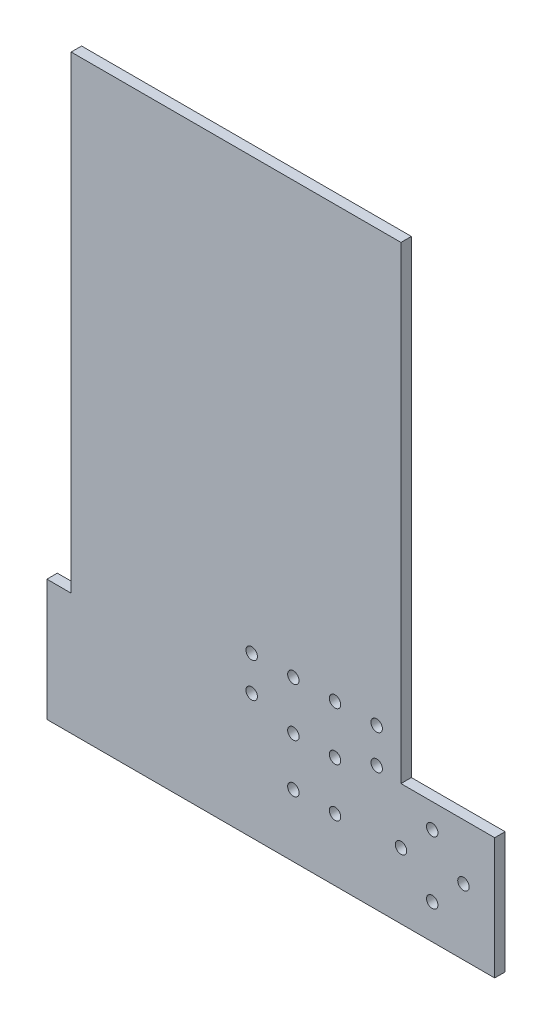
ISO-10303-21;
HEADER;
FILE_DESCRIPTION(('STEP AP214'),'2;1');
FILE_NAME('part.step','',(''),(''),'','','');
FILE_SCHEMA(('AUTOMOTIVE_DESIGN { 1 0 10303 214 1 1 1 1 }'));
ENDSEC;
DATA;
#1=APPLICATION_CONTEXT('core data for automotive mechanical design processes');
#2=APPLICATION_PROTOCOL_DEFINITION('international standard','automotive_design',2000,#1);
#3=PRODUCT_CONTEXT('',#1,'mechanical');
#4=PRODUCT('Part','Part','',(#3));
#5=PRODUCT_RELATED_PRODUCT_CATEGORY('part','',(#4));
#6=PRODUCT_DEFINITION_FORMATION('','',#4);
#7=PRODUCT_DEFINITION_CONTEXT('part definition',#1,'design');
#8=PRODUCT_DEFINITION('design','',#6,#7);
#9=PRODUCT_DEFINITION_SHAPE('','',#8);
#10=(LENGTH_UNIT() NAMED_UNIT(*) SI_UNIT(.MILLI.,.METRE.));
#11=(NAMED_UNIT(*) PLANE_ANGLE_UNIT() SI_UNIT($,.RADIAN.));
#12=(NAMED_UNIT(*) SI_UNIT($,.STERADIAN.) SOLID_ANGLE_UNIT());
#13=UNCERTAINTY_MEASURE_WITH_UNIT(LENGTH_MEASURE(1.E-05),#10,'distance_accuracy_value','');
#14=(GEOMETRIC_REPRESENTATION_CONTEXT(3) GLOBAL_UNCERTAINTY_ASSIGNED_CONTEXT((#13)) GLOBAL_UNIT_ASSIGNED_CONTEXT((#10,
#11,#12)) REPRESENTATION_CONTEXT('',''));
#15=CARTESIAN_POINT('',(0.,0.,0.));
#16=DIRECTION('',(0.,0.,1.));
#17=DIRECTION('',(1.,0.,0.));
#18=AXIS2_PLACEMENT_3D('',#15,#16,#17);
#19=CARTESIAN_POINT('',(0.,0.,3.));
#20=DIRECTION('',(0.,-1.,0.));
#21=DIRECTION('',(0.,0.,-1.));
#22=AXIS2_PLACEMENT_3D('',#19,#20,#21);
#23=PLANE('',#22);
#24=DIRECTION('',(0.,0.,1.));
#25=VECTOR('',#24,1.);
#26=CARTESIAN_POINT('',(-17.,0.,0.));
#27=LINE('',#26,#25);
#28=CARTESIAN_POINT('',(-17.,0.,0.));
#29=VERTEX_POINT('',#28);
#30=CARTESIAN_POINT('',(-17.,0.,3.));
#31=VERTEX_POINT('',#30);
#32=EDGE_CURVE('E160',#29,#31,#27,.T.);
#33=ORIENTED_EDGE('',*,*,#32,.F.);
#34=DIRECTION('',(-1.,0.,0.));
#35=VECTOR('',#34,1.);
#36=CARTESIAN_POINT('',(0.,0.,0.));
#37=LINE('',#36,#35);
#38=CARTESIAN_POINT('',(-24.,0.,0.));
#39=VERTEX_POINT('',#38);
#40=EDGE_CURVE('E81',#29,#39,#37,.T.);
#41=ORIENTED_EDGE('',*,*,#40,.T.);
#42=DIRECTION('',(0.,0.,1.));
#43=VECTOR('',#42,1.);
#44=CARTESIAN_POINT('',(-24.,0.,0.));
#45=LINE('',#44,#43);
#46=CARTESIAN_POINT('',(-24.,0.,3.));
#47=VERTEX_POINT('',#46);
#48=EDGE_CURVE('E173',#39,#47,#45,.T.);
#49=ORIENTED_EDGE('',*,*,#48,.T.);
#50=DIRECTION('',(-1.,0.,0.));
#51=VECTOR('',#50,1.);
#52=CARTESIAN_POINT('',(0.,0.,3.));
#53=LINE('',#52,#51);
#54=EDGE_CURVE('E182',#31,#47,#53,.T.);
#55=ORIENTED_EDGE('',*,*,#54,.F.);
#56=EDGE_LOOP('',(#33,#41,#49,#55));
#57=FACE_BOUND('',#56,.T.);
#58=ADVANCED_FACE('F35',(#57),#23,.F.);
#59=CARTESIAN_POINT('',(0.,-35.,3.));
#60=DIRECTION('',(0.,1.,0.));
#61=DIRECTION('',(0.,0.,1.));
#62=AXIS2_PLACEMENT_3D('',#59,#60,#61);
#63=PLANE('',#62);
#64=DIRECTION('',(1.,0.,0.));
#65=VECTOR('',#64,1.);
#66=CARTESIAN_POINT('',(0.,-35.,0.));
#67=LINE('',#66,#65);
#68=CARTESIAN_POINT('',(-24.,-35.,0.));
#69=VERTEX_POINT('',#68);
#70=CARTESIAN_POINT('',(105.,-35.,0.));
#71=VERTEX_POINT('',#70);
#72=EDGE_CURVE('E82',#69,#71,#67,.T.);
#73=ORIENTED_EDGE('',*,*,#72,.T.);
#74=DIRECTION('',(0.,0.,-1.));
#75=VECTOR('',#74,1.);
#76=CARTESIAN_POINT('',(105.,-35.,3.));
#77=LINE('',#76,#75);
#78=CARTESIAN_POINT('',(105.,-35.,3.));
#79=VERTEX_POINT('',#78);
#80=EDGE_CURVE('E11',#79,#71,#77,.T.);
#81=ORIENTED_EDGE('',*,*,#80,.F.);
#82=DIRECTION('',(1.,0.,0.));
#83=VECTOR('',#82,1.);
#84=CARTESIAN_POINT('',(0.,-35.,3.));
#85=LINE('',#84,#83);
#86=CARTESIAN_POINT('',(-24.,-35.,3.));
#87=VERTEX_POINT('',#86);
#88=EDGE_CURVE('E96',#87,#79,#85,.T.);
#89=ORIENTED_EDGE('',*,*,#88,.F.);
#90=DIRECTION('',(0.,0.,1.));
#91=VECTOR('',#90,1.);
#92=CARTESIAN_POINT('',(-24.,-35.,0.));
#93=LINE('',#92,#91);
#94=EDGE_CURVE('E176',#69,#87,#93,.T.);
#95=ORIENTED_EDGE('',*,*,#94,.F.);
#96=EDGE_LOOP('',(#73,#81,#89,#95));
#97=FACE_BOUND('',#96,.T.);
#98=ADVANCED_FACE('F37',(#97),#63,.F.);
#99=CARTESIAN_POINT('',(105.,0.,3.));
#100=DIRECTION('',(-1.,0.,0.));
#101=DIRECTION('',(0.,0.,1.));
#102=AXIS2_PLACEMENT_3D('',#99,#100,#101);
#103=PLANE('',#102);
#104=DIRECTION('',(0.,1.,0.));
#105=VECTOR('',#104,1.);
#106=CARTESIAN_POINT('',(105.,0.,0.));
#107=LINE('',#106,#105);
#108=CARTESIAN_POINT('',(105.,0.,0.));
#109=VERTEX_POINT('',#108);
#110=EDGE_CURVE('E73',#71,#109,#107,.T.);
#111=ORIENTED_EDGE('',*,*,#110,.T.);
#112=DIRECTION('',(0.,0.,-1.));
#113=VECTOR('',#112,1.);
#114=CARTESIAN_POINT('',(105.,0.,3.));
#115=LINE('',#114,#113);
#116=CARTESIAN_POINT('',(105.,0.,3.));
#117=VERTEX_POINT('',#116);
#118=EDGE_CURVE('E44',#117,#109,#115,.T.);
#119=ORIENTED_EDGE('',*,*,#118,.F.);
#120=DIRECTION('',(0.,1.,0.));
#121=VECTOR('',#120,1.);
#122=CARTESIAN_POINT('',(105.,0.,3.));
#123=LINE('',#122,#121);
#124=EDGE_CURVE('E61',#79,#117,#123,.T.);
#125=ORIENTED_EDGE('',*,*,#124,.F.);
#126=ORIENTED_EDGE('',*,*,#80,.T.);
#127=EDGE_LOOP('',(#111,#119,#125,#126));
#128=FACE_BOUND('',#127,.T.);
#129=ADVANCED_FACE('F75',(#128),#103,.F.);
#130=CARTESIAN_POINT('',(78.,0.,0.));
#131=VERTEX_POINT('',#130);
#132=EDGE_CURVE('E88',#109,#131,#37,.T.);
#133=ORIENTED_EDGE('',*,*,#132,.T.);
#134=DIRECTION('',(0.,0.,1.));
#135=VECTOR('',#134,1.);
#136=CARTESIAN_POINT('',(78.,0.,0.));
#137=LINE('',#136,#135);
#138=CARTESIAN_POINT('',(78.,0.,3.));
#139=VERTEX_POINT('',#138);
#140=EDGE_CURVE('E152',#131,#139,#137,.T.);
#141=ORIENTED_EDGE('',*,*,#140,.T.);
#142=EDGE_CURVE('E89',#117,#139,#53,.T.);
#143=ORIENTED_EDGE('',*,*,#142,.F.);
#144=ORIENTED_EDGE('',*,*,#118,.T.);
#145=EDGE_LOOP('',(#133,#141,#143,#144));
#146=FACE_BOUND('',#145,.T.);
#147=ADVANCED_FACE('F86',(#146),#23,.F.);
#148=CARTESIAN_POINT('',(0.,0.,3.));
#149=DIRECTION('',(0.,0.,1.));
#150=DIRECTION('',(1.,0.,0.));
#151=AXIS2_PLACEMENT_3D('',#148,#149,#150);
#152=PLANE('',#151);
#153=CARTESIAN_POINT('',(59.0000000000001,-17.0000000000036,3.));
#154=DIRECTION('',(0.,0.,1.));
#155=DIRECTION('',(1.,0.,0.));
#156=AXIS2_PLACEMENT_3D('',#153,#154,#155);
#157=CIRCLE('',#156,1.65);
#158=CARTESIAN_POINT('',(60.6500000000001,-17.0000000000036,3.));
#159=VERTEX_POINT('',#158);
#160=EDGE_CURVE('E447',#159,#159,#157,.T.);
#161=ORIENTED_EDGE('',*,*,#160,.F.);
#162=EDGE_LOOP('',(#161));
#163=FACE_BOUND('',#162,.T.);
#164=CARTESIAN_POINT('',(59.0000000000001,-3.00000000000365,3.));
#165=DIRECTION('',(0.,0.,1.));
#166=DIRECTION('',(1.,0.,0.));
#167=AXIS2_PLACEMENT_3D('',#164,#165,#166);
#168=CIRCLE('',#167,1.65);
#169=CARTESIAN_POINT('',(60.6500000000001,-3.00000000000365,3.));
#170=VERTEX_POINT('',#169);
#171=EDGE_CURVE('E449',#170,#170,#168,.T.);
#172=ORIENTED_EDGE('',*,*,#171,.F.);
#173=EDGE_LOOP('',(#172));
#174=FACE_BOUND('',#173,.T.);
#175=CARTESIAN_POINT('',(47.0000000000001,-3.00000000000364,3.));
#176=DIRECTION('',(0.,0.,1.));
#177=DIRECTION('',(1.,0.,0.));
#178=AXIS2_PLACEMENT_3D('',#175,#176,#177);
#179=CIRCLE('',#178,1.65);
#180=CARTESIAN_POINT('',(48.6500000000001,-3.00000000000364,3.));
#181=VERTEX_POINT('',#180);
#182=EDGE_CURVE('E455',#181,#181,#179,.T.);
#183=ORIENTED_EDGE('',*,*,#182,.F.);
#184=EDGE_LOOP('',(#183));
#185=FACE_BOUND('',#184,.T.);
#186=CARTESIAN_POINT('',(59.0000000000001,10.9999999999963,3.));
#187=DIRECTION('',(0.,0.,1.));
#188=DIRECTION('',(1.,0.,0.));
#189=AXIS2_PLACEMENT_3D('',#186,#187,#188);
#190=CIRCLE('',#189,1.65);
#191=CARTESIAN_POINT('',(60.6500000000001,10.9999999999963,3.));
#192=VERTEX_POINT('',#191);
#193=EDGE_CURVE('E458',#192,#192,#190,.T.);
#194=ORIENTED_EDGE('',*,*,#193,.F.);
#195=EDGE_LOOP('',(#194));
#196=FACE_BOUND('',#195,.T.);
#197=CARTESIAN_POINT('',(35.0000000000001,10.9999999999964,3.));
#198=DIRECTION('',(0.,0.,1.));
#199=DIRECTION('',(1.,0.,0.));
#200=AXIS2_PLACEMENT_3D('',#197,#198,#199);
#201=CIRCLE('',#200,1.65);
#202=CARTESIAN_POINT('',(36.6500000000001,10.9999999999964,3.));
#203=VERTEX_POINT('',#202);
#204=EDGE_CURVE('E464',#203,#203,#201,.T.);
#205=ORIENTED_EDGE('',*,*,#204,.F.);
#206=EDGE_LOOP('',(#205));
#207=FACE_BOUND('',#206,.T.);
#208=CARTESIAN_POINT('',(71.0000000000001,0.999999999996344,3.));
#209=DIRECTION('',(0.,0.,1.));
#210=DIRECTION('',(1.,0.,0.));
#211=AXIS2_PLACEMENT_3D('',#208,#209,#210);
#212=CIRCLE('',#211,1.65);
#213=CARTESIAN_POINT('',(72.6500000000001,0.999999999996344,3.));
#214=VERTEX_POINT('',#213);
#215=EDGE_CURVE('E462',#214,#214,#212,.T.);
#216=ORIENTED_EDGE('',*,*,#215,.F.);
#217=EDGE_LOOP('',(#216));
#218=FACE_BOUND('',#217,.T.);
#219=CARTESIAN_POINT('',(71.0000000000001,10.9999999999963,3.));
#220=DIRECTION('',(0.,0.,1.));
#221=DIRECTION('',(1.,0.,0.));
#222=AXIS2_PLACEMENT_3D('',#219,#220,#221);
#223=CIRCLE('',#222,1.65);
#224=CARTESIAN_POINT('',(72.6500000000001,10.9999999999963,3.));
#225=VERTEX_POINT('',#224);
#226=EDGE_CURVE('E452',#225,#225,#223,.T.);
#227=ORIENTED_EDGE('',*,*,#226,.F.);
#228=EDGE_LOOP('',(#227));
#229=FACE_BOUND('',#228,.T.);
#230=CARTESIAN_POINT('',(47.0000000000001,-17.0000000000036,3.));
#231=DIRECTION('',(0.,0.,1.));
#232=DIRECTION('',(1.,0.,0.));
#233=AXIS2_PLACEMENT_3D('',#230,#231,#232);
#234=CIRCLE('',#233,1.65);
#235=CARTESIAN_POINT('',(48.6500000000001,-17.0000000000036,3.));
#236=VERTEX_POINT('',#235);
#237=EDGE_CURVE('E448',#236,#236,#234,.T.);
#238=ORIENTED_EDGE('',*,*,#237,.F.);
#239=EDGE_LOOP('',(#238));
#240=FACE_BOUND('',#239,.T.);
#241=CARTESIAN_POINT('',(47.0000000000001,10.9999999999964,3.));
#242=DIRECTION('',(0.,0.,1.));
#243=DIRECTION('',(1.,0.,0.));
#244=AXIS2_PLACEMENT_3D('',#241,#242,#243);
#245=CIRCLE('',#244,1.65);
#246=CARTESIAN_POINT('',(48.6500000000001,10.9999999999964,3.));
#247=VERTEX_POINT('',#246);
#248=EDGE_CURVE('E518',#247,#247,#245,.T.);
#249=ORIENTED_EDGE('',*,*,#248,.F.);
#250=EDGE_LOOP('',(#249));
#251=FACE_BOUND('',#250,.T.);
#252=CARTESIAN_POINT('',(35.0000000000001,0.999999999996365,3.));
#253=DIRECTION('',(0.,0.,1.));
#254=DIRECTION('',(1.,0.,0.));
#255=AXIS2_PLACEMENT_3D('',#252,#253,#254);
#256=CIRCLE('',#255,1.65);
#257=CARTESIAN_POINT('',(36.6500000000001,0.999999999996365,3.));
#258=VERTEX_POINT('',#257);
#259=EDGE_CURVE('E106',#258,#258,#256,.T.);
#260=ORIENTED_EDGE('',*,*,#259,.F.);
#261=EDGE_LOOP('',(#260));
#262=FACE_BOUND('',#261,.T.);
#263=CARTESIAN_POINT('',(87.0000000000002,-6.99999999999954,3.));
#264=DIRECTION('',(0.,0.,-1.));
#265=DIRECTION('',(-1.,0.,0.));
#266=AXIS2_PLACEMENT_3D('',#263,#264,#265);
#267=CIRCLE('',#266,1.65);
#268=CARTESIAN_POINT('',(85.3500000000002,-6.99999999999954,3.));
#269=VERTEX_POINT('',#268);
#270=EDGE_CURVE('E155',#269,#269,#267,.T.);
#271=ORIENTED_EDGE('',*,*,#270,.T.);
#272=EDGE_LOOP('',(#271));
#273=FACE_BOUND('',#272,.T.);
#274=CARTESIAN_POINT('',(96.0000000000002,-15.9999999999995,3.));
#275=DIRECTION('',(0.,0.,-1.));
#276=DIRECTION('',(-1.,0.,0.));
#277=AXIS2_PLACEMENT_3D('',#274,#275,#276);
#278=CIRCLE('',#277,1.65);
#279=CARTESIAN_POINT('',(94.3500000000002,-15.9999999999995,3.));
#280=VERTEX_POINT('',#279);
#281=EDGE_CURVE('E476',#280,#280,#278,.T.);
#282=ORIENTED_EDGE('',*,*,#281,.T.);
#283=EDGE_LOOP('',(#282));
#284=FACE_BOUND('',#283,.T.);
#285=CARTESIAN_POINT('',(87.0000000000002,-24.9999999999995,3.));
#286=DIRECTION('',(0.,0.,-1.));
#287=DIRECTION('',(-1.,0.,0.));
#288=AXIS2_PLACEMENT_3D('',#285,#286,#287);
#289=CIRCLE('',#288,1.65);
#290=CARTESIAN_POINT('',(85.3500000000002,-24.9999999999995,3.));
#291=VERTEX_POINT('',#290);
#292=EDGE_CURVE('E482',#291,#291,#289,.T.);
#293=ORIENTED_EDGE('',*,*,#292,.T.);
#294=EDGE_LOOP('',(#293));
#295=FACE_BOUND('',#294,.T.);
#296=CARTESIAN_POINT('',(78.0000000000002,-15.9999999999995,3.));
#297=DIRECTION('',(0.,0.,-1.));
#298=DIRECTION('',(-1.,0.,0.));
#299=AXIS2_PLACEMENT_3D('',#296,#297,#298);
#300=CIRCLE('',#299,1.65);
#301=CARTESIAN_POINT('',(76.3500000000002,-15.9999999999995,3.));
#302=VERTEX_POINT('',#301);
#303=EDGE_CURVE('E135',#302,#302,#300,.T.);
#304=ORIENTED_EDGE('',*,*,#303,.T.);
#305=EDGE_LOOP('',(#304));
#306=FACE_BOUND('',#305,.T.);
#307=ORIENTED_EDGE('',*,*,#142,.T.);
#308=DIRECTION('',(0.,1.,0.));
#309=VECTOR('',#308,1.);
#310=CARTESIAN_POINT('',(78.,135.,3.));
#311=LINE('',#310,#309);
#312=CARTESIAN_POINT('',(78.,135.,3.));
#313=VERTEX_POINT('',#312);
#314=EDGE_CURVE('E52',#139,#313,#311,.T.);
#315=ORIENTED_EDGE('',*,*,#314,.T.);
#316=DIRECTION('',(-1.,0.,0.));
#317=VECTOR('',#316,1.);
#318=CARTESIAN_POINT('',(-17.,135.,3.));
#319=LINE('',#318,#317);
#320=CARTESIAN_POINT('',(-17.,135.,3.));
#321=VERTEX_POINT('',#320);
#322=EDGE_CURVE('E154',#313,#321,#319,.T.);
#323=ORIENTED_EDGE('',*,*,#322,.T.);
#324=DIRECTION('',(0.,-1.,0.));
#325=VECTOR('',#324,1.);
#326=CARTESIAN_POINT('',(-17.,0.,3.));
#327=LINE('',#326,#325);
#328=EDGE_CURVE('E146',#321,#31,#327,.T.);
#329=ORIENTED_EDGE('',*,*,#328,.T.);
#330=ORIENTED_EDGE('',*,*,#54,.T.);
#331=DIRECTION('',(0.,-1.,0.));
#332=VECTOR('',#331,1.);
#333=CARTESIAN_POINT('',(-24.,0.,3.));
#334=LINE('',#333,#332);
#335=EDGE_CURVE('E163',#47,#87,#334,.T.);
#336=ORIENTED_EDGE('',*,*,#335,.T.);
#337=ORIENTED_EDGE('',*,*,#88,.T.);
#338=ORIENTED_EDGE('',*,*,#124,.T.);
#339=EDGE_LOOP('',(#307,#315,#323,#329,#330,#336,#337,#338));
#340=FACE_BOUND('',#339,.T.);
#341=ADVANCED_FACE('F201',(#163,#174,#185,#196,#207,#218,#229,#240,#251,#262,#273,#284,#295,
#306,#340),#152,.T.);
#342=CARTESIAN_POINT('',(0.,0.,0.));
#343=DIRECTION('',(0.,0.,1.));
#344=DIRECTION('',(1.,0.,0.));
#345=AXIS2_PLACEMENT_3D('',#342,#343,#344);
#346=PLANE('',#345);
#347=CARTESIAN_POINT('',(59.0000000000001,-17.0000000000036,0.));
#348=DIRECTION('',(0.,0.,1.));
#349=DIRECTION('',(1.,0.,0.));
#350=AXIS2_PLACEMENT_3D('',#347,#348,#349);
#351=CIRCLE('',#350,1.65);
#352=CARTESIAN_POINT('',(60.6500000000001,-17.0000000000036,0.));
#353=VERTEX_POINT('',#352);
#354=EDGE_CURVE('E39',#353,#353,#351,.T.);
#355=ORIENTED_EDGE('',*,*,#354,.T.);
#356=EDGE_LOOP('',(#355));
#357=FACE_BOUND('',#356,.T.);
#358=CARTESIAN_POINT('',(59.0000000000001,-3.00000000000365,0.));
#359=DIRECTION('',(0.,0.,1.));
#360=DIRECTION('',(1.,0.,0.));
#361=AXIS2_PLACEMENT_3D('',#358,#359,#360);
#362=CIRCLE('',#361,1.65);
#363=CARTESIAN_POINT('',(60.6500000000001,-3.00000000000365,0.));
#364=VERTEX_POINT('',#363);
#365=EDGE_CURVE('E126',#364,#364,#362,.T.);
#366=ORIENTED_EDGE('',*,*,#365,.T.);
#367=EDGE_LOOP('',(#366));
#368=FACE_BOUND('',#367,.T.);
#369=CARTESIAN_POINT('',(47.0000000000001,-3.00000000000364,0.));
#370=DIRECTION('',(0.,0.,1.));
#371=DIRECTION('',(1.,0.,0.));
#372=AXIS2_PLACEMENT_3D('',#369,#370,#371);
#373=CIRCLE('',#372,1.65);
#374=CARTESIAN_POINT('',(48.6500000000001,-3.00000000000364,0.));
#375=VERTEX_POINT('',#374);
#376=EDGE_CURVE('E124',#375,#375,#373,.T.);
#377=ORIENTED_EDGE('',*,*,#376,.T.);
#378=EDGE_LOOP('',(#377));
#379=FACE_BOUND('',#378,.T.);
#380=CARTESIAN_POINT('',(59.0000000000001,10.9999999999963,0.));
#381=DIRECTION('',(0.,0.,1.));
#382=DIRECTION('',(1.,0.,0.));
#383=AXIS2_PLACEMENT_3D('',#380,#381,#382);
#384=CIRCLE('',#383,1.65);
#385=CARTESIAN_POINT('',(60.6500000000001,10.9999999999963,0.));
#386=VERTEX_POINT('',#385);
#387=EDGE_CURVE('E121',#386,#386,#384,.T.);
#388=ORIENTED_EDGE('',*,*,#387,.T.);
#389=EDGE_LOOP('',(#388));
#390=FACE_BOUND('',#389,.T.);
#391=CARTESIAN_POINT('',(35.0000000000001,10.9999999999964,0.));
#392=DIRECTION('',(0.,0.,1.));
#393=DIRECTION('',(1.,0.,0.));
#394=AXIS2_PLACEMENT_3D('',#391,#392,#393);
#395=CIRCLE('',#394,1.65);
#396=CARTESIAN_POINT('',(36.6500000000001,10.9999999999964,0.));
#397=VERTEX_POINT('',#396);
#398=EDGE_CURVE('E118',#397,#397,#395,.T.);
#399=ORIENTED_EDGE('',*,*,#398,.T.);
#400=EDGE_LOOP('',(#399));
#401=FACE_BOUND('',#400,.T.);
#402=CARTESIAN_POINT('',(71.0000000000001,0.999999999996344,0.));
#403=DIRECTION('',(0.,0.,1.));
#404=DIRECTION('',(1.,0.,0.));
#405=AXIS2_PLACEMENT_3D('',#402,#403,#404);
#406=CIRCLE('',#405,1.65);
#407=CARTESIAN_POINT('',(72.6500000000001,0.999999999996344,0.));
#408=VERTEX_POINT('',#407);
#409=EDGE_CURVE('E115',#408,#408,#406,.T.);
#410=ORIENTED_EDGE('',*,*,#409,.T.);
#411=EDGE_LOOP('',(#410));
#412=FACE_BOUND('',#411,.T.);
#413=CARTESIAN_POINT('',(71.0000000000001,10.9999999999963,0.));
#414=DIRECTION('',(0.,0.,1.));
#415=DIRECTION('',(1.,0.,0.));
#416=AXIS2_PLACEMENT_3D('',#413,#414,#415);
#417=CIRCLE('',#416,1.65);
#418=CARTESIAN_POINT('',(72.6500000000001,10.9999999999963,0.));
#419=VERTEX_POINT('',#418);
#420=EDGE_CURVE('E112',#419,#419,#417,.T.);
#421=ORIENTED_EDGE('',*,*,#420,.T.);
#422=EDGE_LOOP('',(#421));
#423=FACE_BOUND('',#422,.T.);
#424=CARTESIAN_POINT('',(47.0000000000001,-17.0000000000036,0.));
#425=DIRECTION('',(0.,0.,1.));
#426=DIRECTION('',(1.,0.,0.));
#427=AXIS2_PLACEMENT_3D('',#424,#425,#426);
#428=CIRCLE('',#427,1.65);
#429=CARTESIAN_POINT('',(48.6500000000001,-17.0000000000036,0.));
#430=VERTEX_POINT('',#429);
#431=EDGE_CURVE('E109',#430,#430,#428,.T.);
#432=ORIENTED_EDGE('',*,*,#431,.T.);
#433=EDGE_LOOP('',(#432));
#434=FACE_BOUND('',#433,.T.);
#435=CARTESIAN_POINT('',(47.0000000000001,10.9999999999964,0.));
#436=DIRECTION('',(0.,0.,1.));
#437=DIRECTION('',(1.,0.,0.));
#438=AXIS2_PLACEMENT_3D('',#435,#436,#437);
#439=CIRCLE('',#438,1.65);
#440=CARTESIAN_POINT('',(48.6500000000001,10.9999999999964,0.));
#441=VERTEX_POINT('',#440);
#442=EDGE_CURVE('E105',#441,#441,#439,.T.);
#443=ORIENTED_EDGE('',*,*,#442,.T.);
#444=EDGE_LOOP('',(#443));
#445=FACE_BOUND('',#444,.T.);
#446=CARTESIAN_POINT('',(35.0000000000001,0.999999999996365,0.));
#447=DIRECTION('',(0.,0.,1.));
#448=DIRECTION('',(1.,0.,0.));
#449=AXIS2_PLACEMENT_3D('',#446,#447,#448);
#450=CIRCLE('',#449,1.65);
#451=CARTESIAN_POINT('',(36.6500000000001,0.999999999996365,0.));
#452=VERTEX_POINT('',#451);
#453=EDGE_CURVE('E102',#452,#452,#450,.T.);
#454=ORIENTED_EDGE('',*,*,#453,.T.);
#455=EDGE_LOOP('',(#454));
#456=FACE_BOUND('',#455,.T.);
#457=CARTESIAN_POINT('',(87.0000000000002,-6.99999999999954,0.));
#458=DIRECTION('',(0.,0.,-1.));
#459=DIRECTION('',(-1.,0.,0.));
#460=AXIS2_PLACEMENT_3D('',#457,#458,#459);
#461=CIRCLE('',#460,1.65);
#462=CARTESIAN_POINT('',(85.3500000000002,-6.99999999999954,0.));
#463=VERTEX_POINT('',#462);
#464=EDGE_CURVE('E473',#463,#463,#461,.T.);
#465=ORIENTED_EDGE('',*,*,#464,.F.);
#466=EDGE_LOOP('',(#465));
#467=FACE_BOUND('',#466,.T.);
#468=CARTESIAN_POINT('',(96.0000000000002,-15.9999999999995,0.));
#469=DIRECTION('',(0.,0.,-1.));
#470=DIRECTION('',(-1.,0.,0.));
#471=AXIS2_PLACEMENT_3D('',#468,#469,#470);
#472=CIRCLE('',#471,1.65);
#473=CARTESIAN_POINT('',(94.3500000000002,-15.9999999999995,0.));
#474=VERTEX_POINT('',#473);
#475=EDGE_CURVE('E479',#474,#474,#472,.T.);
#476=ORIENTED_EDGE('',*,*,#475,.F.);
#477=EDGE_LOOP('',(#476));
#478=FACE_BOUND('',#477,.T.);
#479=CARTESIAN_POINT('',(87.0000000000002,-24.9999999999995,0.));
#480=DIRECTION('',(0.,0.,-1.));
#481=DIRECTION('',(-1.,0.,0.));
#482=AXIS2_PLACEMENT_3D('',#479,#480,#481);
#483=CIRCLE('',#482,1.65);
#484=CARTESIAN_POINT('',(85.3500000000002,-24.9999999999995,0.));
#485=VERTEX_POINT('',#484);
#486=EDGE_CURVE('E140',#485,#485,#483,.T.);
#487=ORIENTED_EDGE('',*,*,#486,.F.);
#488=EDGE_LOOP('',(#487));
#489=FACE_BOUND('',#488,.T.);
#490=CARTESIAN_POINT('',(78.0000000000002,-15.9999999999995,0.));
#491=DIRECTION('',(0.,0.,-1.));
#492=DIRECTION('',(-1.,0.,0.));
#493=AXIS2_PLACEMENT_3D('',#490,#491,#492);
#494=CIRCLE('',#493,1.65);
#495=CARTESIAN_POINT('',(76.3500000000002,-15.9999999999995,0.));
#496=VERTEX_POINT('',#495);
#497=EDGE_CURVE('E131',#496,#496,#494,.T.);
#498=ORIENTED_EDGE('',*,*,#497,.F.);
#499=EDGE_LOOP('',(#498));
#500=FACE_BOUND('',#499,.T.);
#501=ORIENTED_EDGE('',*,*,#72,.F.);
#502=DIRECTION('',(0.,-1.,0.));
#503=VECTOR('',#502,1.);
#504=CARTESIAN_POINT('',(-24.,0.,0.));
#505=LINE('',#504,#503);
#506=EDGE_CURVE('E170',#39,#69,#505,.T.);
#507=ORIENTED_EDGE('',*,*,#506,.F.);
#508=ORIENTED_EDGE('',*,*,#40,.F.);
#509=DIRECTION('',(0.,-1.,0.));
#510=VECTOR('',#509,1.);
#511=CARTESIAN_POINT('',(-17.,0.,0.));
#512=LINE('',#511,#510);
#513=CARTESIAN_POINT('',(-17.,135.,0.));
#514=VERTEX_POINT('',#513);
#515=EDGE_CURVE('E149',#514,#29,#512,.T.);
#516=ORIENTED_EDGE('',*,*,#515,.F.);
#517=DIRECTION('',(-1.,0.,0.));
#518=VECTOR('',#517,1.);
#519=CARTESIAN_POINT('',(-17.,135.,0.));
#520=LINE('',#519,#518);
#521=CARTESIAN_POINT('',(78.,135.,0.));
#522=VERTEX_POINT('',#521);
#523=EDGE_CURVE('E145',#522,#514,#520,.T.);
#524=ORIENTED_EDGE('',*,*,#523,.F.);
#525=DIRECTION('',(0.,1.,0.));
#526=VECTOR('',#525,1.);
#527=CARTESIAN_POINT('',(78.,135.,0.));
#528=LINE('',#527,#526);
#529=EDGE_CURVE('E95',#131,#522,#528,.T.);
#530=ORIENTED_EDGE('',*,*,#529,.F.);
#531=ORIENTED_EDGE('',*,*,#132,.F.);
#532=ORIENTED_EDGE('',*,*,#110,.F.);
#533=EDGE_LOOP('',(#501,#507,#508,#516,#524,#530,#531,#532));
#534=FACE_BOUND('',#533,.T.);
#535=ADVANCED_FACE('F92',(#357,#368,#379,#390,#401,#412,#423,#434,#445,#456,#467,#478,#489,#500,
#534),#346,.F.);
#536=CARTESIAN_POINT('',(-24.,0.,0.));
#537=DIRECTION('',(-1.,0.,0.));
#538=DIRECTION('',(0.,-1.,0.));
#539=AXIS2_PLACEMENT_3D('',#536,#537,#538);
#540=PLANE('',#539);
#541=ORIENTED_EDGE('',*,*,#335,.F.);
#542=ORIENTED_EDGE('',*,*,#48,.F.);
#543=ORIENTED_EDGE('',*,*,#506,.T.);
#544=ORIENTED_EDGE('',*,*,#94,.T.);
#545=EDGE_LOOP('',(#541,#542,#543,#544));
#546=FACE_BOUND('',#545,.T.);
#547=ADVANCED_FACE('F199',(#546),#540,.T.);
#548=CARTESIAN_POINT('',(-17.,0.,0.));
#549=DIRECTION('',(-1.,0.,0.));
#550=DIRECTION('',(0.,0.,1.));
#551=AXIS2_PLACEMENT_3D('',#548,#549,#550);
#552=PLANE('',#551);
#553=ORIENTED_EDGE('',*,*,#328,.F.);
#554=DIRECTION('',(0.,0.,1.));
#555=VECTOR('',#554,1.);
#556=CARTESIAN_POINT('',(-17.,135.,0.));
#557=LINE('',#556,#555);
#558=EDGE_CURVE('E164',#514,#321,#557,.T.);
#559=ORIENTED_EDGE('',*,*,#558,.F.);
#560=ORIENTED_EDGE('',*,*,#515,.T.);
#561=ORIENTED_EDGE('',*,*,#32,.T.);
#562=EDGE_LOOP('',(#553,#559,#560,#561));
#563=FACE_BOUND('',#562,.T.);
#564=ADVANCED_FACE('F235',(#563),#552,.T.);
#565=CARTESIAN_POINT('',(-17.,135.,0.));
#566=DIRECTION('',(0.,1.,0.));
#567=DIRECTION('',(0.,0.,1.));
#568=AXIS2_PLACEMENT_3D('',#565,#566,#567);
#569=PLANE('',#568);
#570=ORIENTED_EDGE('',*,*,#322,.F.);
#571=DIRECTION('',(0.,0.,1.));
#572=VECTOR('',#571,1.);
#573=CARTESIAN_POINT('',(78.,135.,0.));
#574=LINE('',#573,#572);
#575=EDGE_CURVE('E167',#522,#313,#574,.T.);
#576=ORIENTED_EDGE('',*,*,#575,.F.);
#577=ORIENTED_EDGE('',*,*,#523,.T.);
#578=ORIENTED_EDGE('',*,*,#558,.T.);
#579=EDGE_LOOP('',(#570,#576,#577,#578));
#580=FACE_BOUND('',#579,.T.);
#581=ADVANCED_FACE('F223',(#580),#569,.T.);
#582=CARTESIAN_POINT('',(78.,135.,0.));
#583=DIRECTION('',(1.,0.,0.));
#584=DIRECTION('',(0.,1.,0.));
#585=AXIS2_PLACEMENT_3D('',#582,#583,#584);
#586=PLANE('',#585);
#587=ORIENTED_EDGE('',*,*,#314,.F.);
#588=ORIENTED_EDGE('',*,*,#140,.F.);
#589=ORIENTED_EDGE('',*,*,#529,.T.);
#590=ORIENTED_EDGE('',*,*,#575,.T.);
#591=EDGE_LOOP('',(#587,#588,#589,#590));
#592=FACE_BOUND('',#591,.T.);
#593=ADVANCED_FACE('F224',(#592),#586,.T.);
#594=CARTESIAN_POINT('',(78.0000000000002,-15.9999999999995,3.));
#595=DIRECTION('',(0.,0.,-1.));
#596=DIRECTION('',(-1.,0.,0.));
#597=AXIS2_PLACEMENT_3D('',#594,#595,#596);
#598=CYLINDRICAL_SURFACE('',#597,1.65);
#599=ORIENTED_EDGE('',*,*,#303,.F.);
#600=EDGE_LOOP('',(#599));
#601=FACE_BOUND('',#600,.T.);
#602=ORIENTED_EDGE('',*,*,#497,.T.);
#603=EDGE_LOOP('',(#602));
#604=FACE_BOUND('',#603,.T.);
#605=ADVANCED_FACE('F226',(#601,#604),#598,.F.);
#606=CARTESIAN_POINT('',(87.0000000000002,-24.9999999999995,3.));
#607=DIRECTION('',(0.,0.,-1.));
#608=DIRECTION('',(-1.,0.,0.));
#609=AXIS2_PLACEMENT_3D('',#606,#607,#608);
#610=CYLINDRICAL_SURFACE('',#609,1.65);
#611=ORIENTED_EDGE('',*,*,#292,.F.);
#612=EDGE_LOOP('',(#611));
#613=FACE_BOUND('',#612,.T.);
#614=ORIENTED_EDGE('',*,*,#486,.T.);
#615=EDGE_LOOP('',(#614));
#616=FACE_BOUND('',#615,.T.);
#617=ADVANCED_FACE('F232',(#613,#616),#610,.F.);
#618=CARTESIAN_POINT('',(96.0000000000002,-15.9999999999995,3.));
#619=DIRECTION('',(0.,0.,-1.));
#620=DIRECTION('',(-1.,0.,0.));
#621=AXIS2_PLACEMENT_3D('',#618,#619,#620);
#622=CYLINDRICAL_SURFACE('',#621,1.65);
#623=ORIENTED_EDGE('',*,*,#281,.F.);
#624=EDGE_LOOP('',(#623));
#625=FACE_BOUND('',#624,.T.);
#626=ORIENTED_EDGE('',*,*,#475,.T.);
#627=EDGE_LOOP('',(#626));
#628=FACE_BOUND('',#627,.T.);
#629=ADVANCED_FACE('F315',(#625,#628),#622,.F.);
#630=CARTESIAN_POINT('',(87.0000000000002,-6.99999999999954,3.));
#631=DIRECTION('',(0.,0.,-1.));
#632=DIRECTION('',(-1.,0.,0.));
#633=AXIS2_PLACEMENT_3D('',#630,#631,#632);
#634=CYLINDRICAL_SURFACE('',#633,1.65);
#635=ORIENTED_EDGE('',*,*,#270,.F.);
#636=EDGE_LOOP('',(#635));
#637=FACE_BOUND('',#636,.T.);
#638=ORIENTED_EDGE('',*,*,#464,.T.);
#639=EDGE_LOOP('',(#638));
#640=FACE_BOUND('',#639,.T.);
#641=ADVANCED_FACE('F325',(#637,#640),#634,.F.);
#642=CARTESIAN_POINT('',(35.0000000000001,0.999999999996365,-37.));
#643=DIRECTION('',(0.,0.,1.));
#644=DIRECTION('',(1.,0.,0.));
#645=AXIS2_PLACEMENT_3D('',#642,#643,#644);
#646=CYLINDRICAL_SURFACE('',#645,1.65);
#647=ORIENTED_EDGE('',*,*,#259,.T.);
#648=EDGE_LOOP('',(#647));
#649=FACE_BOUND('',#648,.T.);
#650=ORIENTED_EDGE('',*,*,#453,.F.);
#651=EDGE_LOOP('',(#650));
#652=FACE_BOUND('',#651,.T.);
#653=ADVANCED_FACE('F334',(#649,#652),#646,.F.);
#654=CARTESIAN_POINT('',(47.0000000000001,10.9999999999964,-37.));
#655=DIRECTION('',(0.,0.,1.));
#656=DIRECTION('',(1.,0.,0.));
#657=AXIS2_PLACEMENT_3D('',#654,#655,#656);
#658=CYLINDRICAL_SURFACE('',#657,1.65);
#659=ORIENTED_EDGE('',*,*,#248,.T.);
#660=EDGE_LOOP('',(#659));
#661=FACE_BOUND('',#660,.T.);
#662=ORIENTED_EDGE('',*,*,#442,.F.);
#663=EDGE_LOOP('',(#662));
#664=FACE_BOUND('',#663,.T.);
#665=ADVANCED_FACE('F350',(#661,#664),#658,.F.);
#666=CARTESIAN_POINT('',(47.0000000000001,-17.0000000000036,-37.));
#667=DIRECTION('',(0.,0.,1.));
#668=DIRECTION('',(1.,0.,0.));
#669=AXIS2_PLACEMENT_3D('',#666,#667,#668);
#670=CYLINDRICAL_SURFACE('',#669,1.65);
#671=ORIENTED_EDGE('',*,*,#237,.T.);
#672=EDGE_LOOP('',(#671));
#673=FACE_BOUND('',#672,.T.);
#674=ORIENTED_EDGE('',*,*,#431,.F.);
#675=EDGE_LOOP('',(#674));
#676=FACE_BOUND('',#675,.T.);
#677=ADVANCED_FACE('F360',(#673,#676),#670,.F.);
#678=CARTESIAN_POINT('',(71.0000000000001,10.9999999999963,-37.));
#679=DIRECTION('',(0.,0.,1.));
#680=DIRECTION('',(1.,0.,0.));
#681=AXIS2_PLACEMENT_3D('',#678,#679,#680);
#682=CYLINDRICAL_SURFACE('',#681,1.65);
#683=ORIENTED_EDGE('',*,*,#226,.T.);
#684=EDGE_LOOP('',(#683));
#685=FACE_BOUND('',#684,.T.);
#686=ORIENTED_EDGE('',*,*,#420,.F.);
#687=EDGE_LOOP('',(#686));
#688=FACE_BOUND('',#687,.T.);
#689=ADVANCED_FACE('F370',(#685,#688),#682,.F.);
#690=CARTESIAN_POINT('',(71.0000000000001,0.999999999996344,-37.));
#691=DIRECTION('',(0.,0.,1.));
#692=DIRECTION('',(1.,0.,0.));
#693=AXIS2_PLACEMENT_3D('',#690,#691,#692);
#694=CYLINDRICAL_SURFACE('',#693,1.65);
#695=ORIENTED_EDGE('',*,*,#215,.T.);
#696=EDGE_LOOP('',(#695));
#697=FACE_BOUND('',#696,.T.);
#698=ORIENTED_EDGE('',*,*,#409,.F.);
#699=EDGE_LOOP('',(#698));
#700=FACE_BOUND('',#699,.T.);
#701=ADVANCED_FACE('F380',(#697,#700),#694,.F.);
#702=CARTESIAN_POINT('',(35.0000000000001,10.9999999999964,-37.));
#703=DIRECTION('',(0.,0.,1.));
#704=DIRECTION('',(1.,0.,0.));
#705=AXIS2_PLACEMENT_3D('',#702,#703,#704);
#706=CYLINDRICAL_SURFACE('',#705,1.65);
#707=ORIENTED_EDGE('',*,*,#204,.T.);
#708=EDGE_LOOP('',(#707));
#709=FACE_BOUND('',#708,.T.);
#710=ORIENTED_EDGE('',*,*,#398,.F.);
#711=EDGE_LOOP('',(#710));
#712=FACE_BOUND('',#711,.T.);
#713=ADVANCED_FACE('F390',(#709,#712),#706,.F.);
#714=CARTESIAN_POINT('',(59.0000000000001,10.9999999999963,-37.));
#715=DIRECTION('',(0.,0.,1.));
#716=DIRECTION('',(1.,0.,0.));
#717=AXIS2_PLACEMENT_3D('',#714,#715,#716);
#718=CYLINDRICAL_SURFACE('',#717,1.65);
#719=ORIENTED_EDGE('',*,*,#193,.T.);
#720=EDGE_LOOP('',(#719));
#721=FACE_BOUND('',#720,.T.);
#722=ORIENTED_EDGE('',*,*,#387,.F.);
#723=EDGE_LOOP('',(#722));
#724=FACE_BOUND('',#723,.T.);
#725=ADVANCED_FACE('F400',(#721,#724),#718,.F.);
#726=CARTESIAN_POINT('',(47.0000000000001,-3.00000000000364,-37.));
#727=DIRECTION('',(0.,0.,1.));
#728=DIRECTION('',(1.,0.,0.));
#729=AXIS2_PLACEMENT_3D('',#726,#727,#728);
#730=CYLINDRICAL_SURFACE('',#729,1.65);
#731=ORIENTED_EDGE('',*,*,#182,.T.);
#732=EDGE_LOOP('',(#731));
#733=FACE_BOUND('',#732,.T.);
#734=ORIENTED_EDGE('',*,*,#376,.F.);
#735=EDGE_LOOP('',(#734));
#736=FACE_BOUND('',#735,.T.);
#737=ADVANCED_FACE('F410',(#733,#736),#730,.F.);
#738=CARTESIAN_POINT('',(59.0000000000001,-3.00000000000365,-37.));
#739=DIRECTION('',(0.,0.,1.));
#740=DIRECTION('',(1.,0.,0.));
#741=AXIS2_PLACEMENT_3D('',#738,#739,#740);
#742=CYLINDRICAL_SURFACE('',#741,1.65);
#743=ORIENTED_EDGE('',*,*,#171,.T.);
#744=EDGE_LOOP('',(#743));
#745=FACE_BOUND('',#744,.T.);
#746=ORIENTED_EDGE('',*,*,#365,.F.);
#747=EDGE_LOOP('',(#746));
#748=FACE_BOUND('',#747,.T.);
#749=ADVANCED_FACE('F420',(#745,#748),#742,.F.);
#750=CARTESIAN_POINT('',(59.0000000000001,-17.0000000000036,-37.));
#751=DIRECTION('',(0.,0.,1.));
#752=DIRECTION('',(1.,0.,0.));
#753=AXIS2_PLACEMENT_3D('',#750,#751,#752);
#754=CYLINDRICAL_SURFACE('',#753,1.65);
#755=ORIENTED_EDGE('',*,*,#160,.T.);
#756=EDGE_LOOP('',(#755));
#757=FACE_BOUND('',#756,.T.);
#758=ORIENTED_EDGE('',*,*,#354,.F.);
#759=EDGE_LOOP('',(#758));
#760=FACE_BOUND('',#759,.T.);
#761=ADVANCED_FACE('F430',(#757,#760),#754,.F.);
#762=CLOSED_SHELL('',(#58,#98,#129,#147,#341,#535,#547,#564,#581,#593,#605,#617,#629,#641,#653,
#665,#677,#689,#701,#713,#725,#737,#749,#761));
#763=MANIFOLD_SOLID_BREP('B2',#762);
#764=ADVANCED_BREP_SHAPE_REPRESENTATION('',(#18,#763),#14);
#765=SHAPE_DEFINITION_REPRESENTATION(#9,#764);
ENDSEC;
END-ISO-10303-21;
